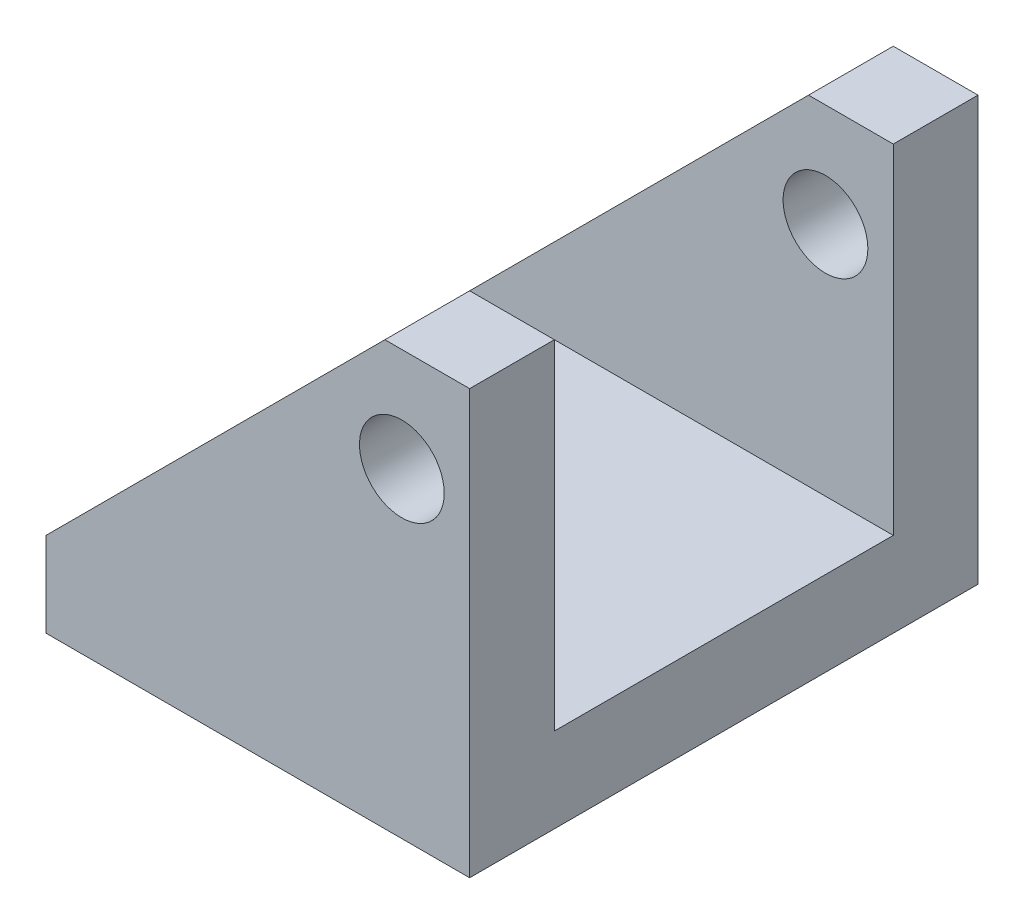
ISO-10303-21;
HEADER;
FILE_DESCRIPTION(('STEP AP214'),'2;1');
FILE_NAME('part.step','',(''),(''),'','','');
FILE_SCHEMA(('AUTOMOTIVE_DESIGN { 1 0 10303 214 1 1 1 1 }'));
ENDSEC;
DATA;
#1=APPLICATION_CONTEXT('core data for automotive mechanical design processes');
#2=APPLICATION_PROTOCOL_DEFINITION('international standard','automotive_design',2000,#1);
#3=PRODUCT_CONTEXT('',#1,'mechanical');
#4=PRODUCT('Part','Part','',(#3));
#5=PRODUCT_RELATED_PRODUCT_CATEGORY('part','',(#4));
#6=PRODUCT_DEFINITION_FORMATION('','',#4);
#7=PRODUCT_DEFINITION_CONTEXT('part definition',#1,'design');
#8=PRODUCT_DEFINITION('design','',#6,#7);
#9=PRODUCT_DEFINITION_SHAPE('','',#8);
#10=(LENGTH_UNIT() NAMED_UNIT(*) SI_UNIT(.MILLI.,.METRE.));
#11=(NAMED_UNIT(*) PLANE_ANGLE_UNIT() SI_UNIT($,.RADIAN.));
#12=(NAMED_UNIT(*) SI_UNIT($,.STERADIAN.) SOLID_ANGLE_UNIT());
#13=UNCERTAINTY_MEASURE_WITH_UNIT(LENGTH_MEASURE(1.E-05),#10,'distance_accuracy_value','');
#14=(GEOMETRIC_REPRESENTATION_CONTEXT(3) GLOBAL_UNCERTAINTY_ASSIGNED_CONTEXT((#13)) GLOBAL_UNIT_ASSIGNED_CONTEXT((#10,
#11,#12)) REPRESENTATION_CONTEXT('',''));
#15=CARTESIAN_POINT('',(0.,0.,0.));
#16=DIRECTION('',(0.,0.,1.));
#17=DIRECTION('',(1.,0.,0.));
#18=AXIS2_PLACEMENT_3D('',#15,#16,#17);
#19=CARTESIAN_POINT('',(-6.35,31.75,38.1));
#20=DIRECTION('',(0.,-1.,0.));
#21=DIRECTION('',(0.,0.,-1.));
#22=AXIS2_PLACEMENT_3D('',#19,#20,#21);
#23=PLANE('',#22);
#24=DIRECTION('',(0.,0.,-1.));
#25=VECTOR('',#24,1.);
#26=CARTESIAN_POINT('',(0.,31.75,38.1));
#27=LINE('',#26,#25);
#28=CARTESIAN_POINT('',(0.,31.75,38.1));
#29=VERTEX_POINT('',#28);
#30=CARTESIAN_POINT('',(0.,31.75,31.75));
#31=VERTEX_POINT('',#30);
#32=EDGE_CURVE('E117',#29,#31,#27,.T.);
#33=ORIENTED_EDGE('',*,*,#32,.T.);
#34=DIRECTION('',(1.,0.,0.));
#35=VECTOR('',#34,1.);
#36=CARTESIAN_POINT('',(-38.1,31.75,31.75));
#37=LINE('',#36,#35);
#38=CARTESIAN_POINT('',(-6.35000000000002,31.75,31.75));
#39=VERTEX_POINT('',#38);
#40=EDGE_CURVE('E141',#39,#31,#37,.T.);
#41=ORIENTED_EDGE('',*,*,#40,.F.);
#42=DIRECTION('',(0.,0.,-1.));
#43=VECTOR('',#42,1.);
#44=CARTESIAN_POINT('',(-6.35,31.75,38.1));
#45=LINE('',#44,#43);
#46=CARTESIAN_POINT('',(-6.35,31.75,38.1));
#47=VERTEX_POINT('',#46);
#48=EDGE_CURVE('E130',#47,#39,#45,.T.);
#49=ORIENTED_EDGE('',*,*,#48,.F.);
#50=DIRECTION('',(-1.,0.,0.));
#51=VECTOR('',#50,1.);
#52=CARTESIAN_POINT('',(-6.35,31.75,38.1));
#53=LINE('',#52,#51);
#54=EDGE_CURVE('E109',#29,#47,#53,.T.);
#55=ORIENTED_EDGE('',*,*,#54,.F.);
#56=EDGE_LOOP('',(#33,#41,#49,#55));
#57=FACE_BOUND('',#56,.T.);
#58=ADVANCED_FACE('F39',(#57),#23,.F.);
#59=CARTESIAN_POINT('',(-31.75,6.35,38.1));
#60=DIRECTION('',(0.707106781186547,-0.707106781186547,0.));
#61=DIRECTION('',(0.707106781186548,0.707106781186548,0.));
#62=AXIS2_PLACEMENT_3D('',#59,#60,#61);
#63=PLANE('',#62);
#64=ORIENTED_EDGE('',*,*,#48,.T.);
#65=DIRECTION('',(-0.707106781186547,-0.707106781186547,0.));
#66=VECTOR('',#65,1.);
#67=CARTESIAN_POINT('',(-31.75,6.35,31.75));
#68=LINE('',#67,#66);
#69=CARTESIAN_POINT('',(-31.75,6.35,31.75));
#70=VERTEX_POINT('',#69);
#71=EDGE_CURVE('E11',#39,#70,#68,.T.);
#72=ORIENTED_EDGE('',*,*,#71,.T.);
#73=DIRECTION('',(0.,0.,-1.));
#74=VECTOR('',#73,1.);
#75=CARTESIAN_POINT('',(-31.75,6.35,38.1));
#76=LINE('',#75,#74);
#77=CARTESIAN_POINT('',(-31.75,6.35,38.1));
#78=VERTEX_POINT('',#77);
#79=EDGE_CURVE('E156',#78,#70,#76,.T.);
#80=ORIENTED_EDGE('',*,*,#79,.F.);
#81=DIRECTION('',(-0.707106781186547,-0.707106781186547,0.));
#82=VECTOR('',#81,1.);
#83=CARTESIAN_POINT('',(-31.75,6.35,38.1));
#84=LINE('',#83,#82);
#85=EDGE_CURVE('E65',#47,#78,#84,.T.);
#86=ORIENTED_EDGE('',*,*,#85,.F.);
#87=EDGE_LOOP('',(#64,#72,#80,#86));
#88=FACE_BOUND('',#87,.T.);
#89=ADVANCED_FACE('F205',(#88),#63,.F.);
#90=CARTESIAN_POINT('',(-31.75,0.,38.1));
#91=DIRECTION('',(1.,0.,0.));
#92=DIRECTION('',(0.,0.,-1.));
#93=AXIS2_PLACEMENT_3D('',#90,#91,#92);
#94=PLANE('',#93);
#95=DIRECTION('',(0.,-1.,0.));
#96=VECTOR('',#95,1.);
#97=CARTESIAN_POINT('',(-31.75,0.,0.));
#98=LINE('',#97,#96);
#99=CARTESIAN_POINT('',(-31.75,6.35,0.));
#100=VERTEX_POINT('',#99);
#101=CARTESIAN_POINT('',(-31.75,0.,0.));
#102=VERTEX_POINT('',#101);
#103=EDGE_CURVE('E137',#100,#102,#98,.T.);
#104=ORIENTED_EDGE('',*,*,#103,.T.);
#105=DIRECTION('',(0.,0.,-1.));
#106=VECTOR('',#105,1.);
#107=CARTESIAN_POINT('',(-31.75,0.,38.1));
#108=LINE('',#107,#106);
#109=CARTESIAN_POINT('',(-31.75,0.,38.1));
#110=VERTEX_POINT('',#109);
#111=EDGE_CURVE('E166',#110,#102,#108,.T.);
#112=ORIENTED_EDGE('',*,*,#111,.F.);
#113=DIRECTION('',(0.,-1.,0.));
#114=VECTOR('',#113,1.);
#115=CARTESIAN_POINT('',(-31.75,0.,38.1));
#116=LINE('',#115,#114);
#117=EDGE_CURVE('E155',#78,#110,#116,.T.);
#118=ORIENTED_EDGE('',*,*,#117,.F.);
#119=ORIENTED_EDGE('',*,*,#79,.T.);
#120=CARTESIAN_POINT('',(-31.75,6.35,6.35000000000002));
#121=VERTEX_POINT('',#120);
#122=EDGE_CURVE('E161',#70,#121,#76,.T.);
#123=ORIENTED_EDGE('',*,*,#122,.T.);
#124=EDGE_CURVE('E90',#121,#100,#76,.T.);
#125=ORIENTED_EDGE('',*,*,#124,.T.);
#126=EDGE_LOOP('',(#104,#112,#118,#119,#123,#125));
#127=FACE_BOUND('',#126,.T.);
#128=ADVANCED_FACE('F41',(#127),#94,.F.);
#129=CARTESIAN_POINT('',(-31.75,0.,38.1));
#130=DIRECTION('',(0.,1.,0.));
#131=DIRECTION('',(0.,0.,1.));
#132=AXIS2_PLACEMENT_3D('',#129,#130,#131);
#133=PLANE('',#132);
#134=DIRECTION('',(1.,0.,0.));
#135=VECTOR('',#134,1.);
#136=CARTESIAN_POINT('',(-31.75,0.,0.));
#137=LINE('',#136,#135);
#138=CARTESIAN_POINT('',(0.,0.,0.));
#139=VERTEX_POINT('',#138);
#140=EDGE_CURVE('E140',#102,#139,#137,.T.);
#141=ORIENTED_EDGE('',*,*,#140,.T.);
#142=DIRECTION('',(0.,0.,-1.));
#143=VECTOR('',#142,1.);
#144=CARTESIAN_POINT('',(0.,0.,38.1));
#145=LINE('',#144,#143);
#146=CARTESIAN_POINT('',(0.,0.,38.1));
#147=VERTEX_POINT('',#146);
#148=EDGE_CURVE('E126',#147,#139,#145,.T.);
#149=ORIENTED_EDGE('',*,*,#148,.F.);
#150=DIRECTION('',(1.,0.,0.));
#151=VECTOR('',#150,1.);
#152=CARTESIAN_POINT('',(-31.75,0.,38.1));
#153=LINE('',#152,#151);
#154=EDGE_CURVE('E99',#110,#147,#153,.T.);
#155=ORIENTED_EDGE('',*,*,#154,.F.);
#156=ORIENTED_EDGE('',*,*,#111,.T.);
#157=EDGE_LOOP('',(#141,#149,#155,#156));
#158=FACE_BOUND('',#157,.T.);
#159=ADVANCED_FACE('F268',(#158),#133,.F.);
#160=CARTESIAN_POINT('',(0.,0.,38.1));
#161=DIRECTION('',(-1.,0.,0.));
#162=DIRECTION('',(0.,0.,1.));
#163=AXIS2_PLACEMENT_3D('',#160,#161,#162);
#164=PLANE('',#163);
#165=DIRECTION('',(0.,0.,-1.));
#166=VECTOR('',#165,1.);
#167=CARTESIAN_POINT('',(0.,6.35,31.75));
#168=LINE('',#167,#166);
#169=CARTESIAN_POINT('',(0.,6.35,31.75));
#170=VERTEX_POINT('',#169);
#171=CARTESIAN_POINT('',(0.,6.35,6.35));
#172=VERTEX_POINT('',#171);
#173=EDGE_CURVE('E220',#170,#172,#168,.T.);
#174=ORIENTED_EDGE('',*,*,#173,.F.);
#175=DIRECTION('',(0.,-1.,0.));
#176=VECTOR('',#175,1.);
#177=CARTESIAN_POINT('',(0.,31.75,31.75));
#178=LINE('',#177,#176);
#179=EDGE_CURVE('E122',#31,#170,#178,.T.);
#180=ORIENTED_EDGE('',*,*,#179,.F.);
#181=ORIENTED_EDGE('',*,*,#32,.F.);
#182=DIRECTION('',(0.,1.,0.));
#183=VECTOR('',#182,1.);
#184=CARTESIAN_POINT('',(0.,0.,38.1));
#185=LINE('',#184,#183);
#186=EDGE_CURVE('E105',#147,#29,#185,.T.);
#187=ORIENTED_EDGE('',*,*,#186,.F.);
#188=ORIENTED_EDGE('',*,*,#148,.T.);
#189=DIRECTION('',(0.,1.,0.));
#190=VECTOR('',#189,1.);
#191=CARTESIAN_POINT('',(0.,0.,0.));
#192=LINE('',#191,#190);
#193=CARTESIAN_POINT('',(0.,31.75,0.));
#194=VERTEX_POINT('',#193);
#195=EDGE_CURVE('E144',#139,#194,#192,.T.);
#196=ORIENTED_EDGE('',*,*,#195,.T.);
#197=CARTESIAN_POINT('',(0.,31.75,6.35));
#198=VERTEX_POINT('',#197);
#199=EDGE_CURVE('E127',#198,#194,#27,.T.);
#200=ORIENTED_EDGE('',*,*,#199,.F.);
#201=DIRECTION('',(0.,1.,0.));
#202=VECTOR('',#201,1.);
#203=CARTESIAN_POINT('',(0.,31.75,6.35));
#204=LINE('',#203,#202);
#205=EDGE_CURVE('E202',#172,#198,#204,.T.);
#206=ORIENTED_EDGE('',*,*,#205,.F.);
#207=EDGE_LOOP('',(#174,#180,#181,#187,#188,#196,#200,#206));
#208=FACE_BOUND('',#207,.T.);
#209=ADVANCED_FACE('F119',(#208),#164,.F.);
#210=CARTESIAN_POINT('',(-6.35,31.75,6.35));
#211=VERTEX_POINT('',#210);
#212=CARTESIAN_POINT('',(-6.35,31.75,0.));
#213=VERTEX_POINT('',#212);
#214=EDGE_CURVE('E160',#211,#213,#45,.T.);
#215=ORIENTED_EDGE('',*,*,#214,.F.);
#216=DIRECTION('',(1.,0.,0.));
#217=VECTOR('',#216,1.);
#218=CARTESIAN_POINT('',(-38.1,31.75,6.35));
#219=LINE('',#218,#217);
#220=EDGE_CURVE('E182',#211,#198,#219,.T.);
#221=ORIENTED_EDGE('',*,*,#220,.T.);
#222=ORIENTED_EDGE('',*,*,#199,.T.);
#223=DIRECTION('',(-1.,0.,0.));
#224=VECTOR('',#223,1.);
#225=CARTESIAN_POINT('',(-6.35,31.75,0.));
#226=LINE('',#225,#224);
#227=EDGE_CURVE('E148',#194,#213,#226,.T.);
#228=ORIENTED_EDGE('',*,*,#227,.T.);
#229=EDGE_LOOP('',(#215,#221,#222,#228));
#230=FACE_BOUND('',#229,.T.);
#231=ADVANCED_FACE('F180',(#230),#23,.F.);
#232=ORIENTED_EDGE('',*,*,#124,.F.);
#233=DIRECTION('',(0.707106781186547,0.707106781186547,0.));
#234=VECTOR('',#233,1.);
#235=CARTESIAN_POINT('',(-31.75,6.35,6.34999999999999));
#236=LINE('',#235,#234);
#237=EDGE_CURVE('E49',#121,#211,#236,.T.);
#238=ORIENTED_EDGE('',*,*,#237,.T.);
#239=ORIENTED_EDGE('',*,*,#214,.T.);
#240=DIRECTION('',(-0.707106781186547,-0.707106781186547,0.));
#241=VECTOR('',#240,1.);
#242=CARTESIAN_POINT('',(-31.75,6.35,0.));
#243=LINE('',#242,#241);
#244=EDGE_CURVE('E152',#213,#100,#243,.T.);
#245=ORIENTED_EDGE('',*,*,#244,.T.);
#246=EDGE_LOOP('',(#232,#238,#239,#245));
#247=FACE_BOUND('',#246,.T.);
#248=ADVANCED_FACE('F174',(#247),#63,.F.);
#249=CARTESIAN_POINT('',(0.,0.,38.1));
#250=DIRECTION('',(0.,0.,-1.));
#251=DIRECTION('',(-1.,0.,0.));
#252=AXIS2_PLACEMENT_3D('',#249,#250,#251);
#253=PLANE('',#252);
#254=CARTESIAN_POINT('',(-5.08,24.,38.1));
#255=DIRECTION('',(0.,0.,1.));
#256=DIRECTION('',(1.,0.,0.));
#257=AXIS2_PLACEMENT_3D('',#254,#255,#256);
#258=CIRCLE('',#257,3.175);
#259=CARTESIAN_POINT('',(-1.905,24.,38.1));
#260=VERTEX_POINT('',#259);
#261=EDGE_CURVE('E229',#260,#260,#258,.T.);
#262=ORIENTED_EDGE('',*,*,#261,.F.);
#263=EDGE_LOOP('',(#262));
#264=FACE_BOUND('',#263,.T.);
#265=ORIENTED_EDGE('',*,*,#117,.T.);
#266=ORIENTED_EDGE('',*,*,#154,.T.);
#267=ORIENTED_EDGE('',*,*,#186,.T.);
#268=ORIENTED_EDGE('',*,*,#54,.T.);
#269=ORIENTED_EDGE('',*,*,#85,.T.);
#270=EDGE_LOOP('',(#265,#266,#267,#268,#269));
#271=FACE_BOUND('',#270,.T.);
#272=ADVANCED_FACE('F107',(#264,#271),#253,.F.);
#273=CARTESIAN_POINT('',(0.,0.,0.));
#274=DIRECTION('',(0.,0.,-1.));
#275=DIRECTION('',(-1.,0.,0.));
#276=AXIS2_PLACEMENT_3D('',#273,#274,#275);
#277=PLANE('',#276);
#278=CARTESIAN_POINT('',(-5.08,24.,0.));
#279=DIRECTION('',(0.,0.,1.));
#280=DIRECTION('',(1.,0.,0.));
#281=AXIS2_PLACEMENT_3D('',#278,#279,#280);
#282=CIRCLE('',#281,3.175);
#283=CARTESIAN_POINT('',(-1.905,24.,0.));
#284=VERTEX_POINT('',#283);
#285=EDGE_CURVE('E233',#284,#284,#282,.T.);
#286=ORIENTED_EDGE('',*,*,#285,.T.);
#287=EDGE_LOOP('',(#286));
#288=FACE_BOUND('',#287,.T.);
#289=ORIENTED_EDGE('',*,*,#103,.F.);
#290=ORIENTED_EDGE('',*,*,#244,.F.);
#291=ORIENTED_EDGE('',*,*,#227,.F.);
#292=ORIENTED_EDGE('',*,*,#195,.F.);
#293=ORIENTED_EDGE('',*,*,#140,.F.);
#294=EDGE_LOOP('',(#289,#290,#291,#292,#293));
#295=FACE_BOUND('',#294,.T.);
#296=ADVANCED_FACE('F278',(#288,#295),#277,.T.);
#297=CARTESIAN_POINT('',(-38.1,31.75,31.75));
#298=DIRECTION('',(0.,0.,1.));
#299=DIRECTION('',(1.,0.,0.));
#300=AXIS2_PLACEMENT_3D('',#297,#298,#299);
#301=PLANE('',#300);
#302=CARTESIAN_POINT('',(-5.08,24.,31.75));
#303=DIRECTION('',(0.,0.,1.));
#304=DIRECTION('',(1.,0.,0.));
#305=AXIS2_PLACEMENT_3D('',#302,#303,#304);
#306=CIRCLE('',#305,3.175);
#307=CARTESIAN_POINT('',(-1.905,24.,31.75));
#308=VERTEX_POINT('',#307);
#309=EDGE_CURVE('E225',#308,#308,#306,.T.);
#310=ORIENTED_EDGE('',*,*,#309,.T.);
#311=EDGE_LOOP('',(#310));
#312=FACE_BOUND('',#311,.T.);
#313=ORIENTED_EDGE('',*,*,#40,.T.);
#314=ORIENTED_EDGE('',*,*,#179,.T.);
#315=DIRECTION('',(1.,0.,0.));
#316=VECTOR('',#315,1.);
#317=CARTESIAN_POINT('',(-38.1,6.35,31.75));
#318=LINE('',#317,#316);
#319=EDGE_CURVE('E195',#70,#170,#318,.T.);
#320=ORIENTED_EDGE('',*,*,#319,.F.);
#321=ORIENTED_EDGE('',*,*,#71,.F.);
#322=EDGE_LOOP('',(#313,#314,#320,#321));
#323=FACE_BOUND('',#322,.T.);
#324=ADVANCED_FACE('F200',(#312,#323),#301,.F.);
#325=CARTESIAN_POINT('',(-38.1,31.75,6.35));
#326=DIRECTION('',(0.,0.,-1.));
#327=DIRECTION('',(0.,1.,0.));
#328=AXIS2_PLACEMENT_3D('',#325,#326,#327);
#329=PLANE('',#328);
#330=CARTESIAN_POINT('',(-5.08,24.,6.35));
#331=DIRECTION('',(0.,0.,-1.));
#332=DIRECTION('',(0.,1.,0.));
#333=AXIS2_PLACEMENT_3D('',#330,#331,#332);
#334=CIRCLE('',#333,3.175);
#335=CARTESIAN_POINT('',(-1.905,24.,6.35));
#336=VERTEX_POINT('',#335);
#337=EDGE_CURVE('E43',#336,#336,#334,.T.);
#338=ORIENTED_EDGE('',*,*,#337,.T.);
#339=EDGE_LOOP('',(#338));
#340=FACE_BOUND('',#339,.T.);
#341=DIRECTION('',(1.,0.,0.));
#342=VECTOR('',#341,1.);
#343=CARTESIAN_POINT('',(-38.1,6.35,6.35));
#344=LINE('',#343,#342);
#345=EDGE_CURVE('E56',#121,#172,#344,.T.);
#346=ORIENTED_EDGE('',*,*,#345,.T.);
#347=ORIENTED_EDGE('',*,*,#205,.T.);
#348=ORIENTED_EDGE('',*,*,#220,.F.);
#349=ORIENTED_EDGE('',*,*,#237,.F.);
#350=EDGE_LOOP('',(#346,#347,#348,#349));
#351=FACE_BOUND('',#350,.T.);
#352=ADVANCED_FACE('F242',(#340,#351),#329,.F.);
#353=CARTESIAN_POINT('',(-38.1,6.35,31.75));
#354=DIRECTION('',(0.,-1.,0.));
#355=DIRECTION('',(0.,0.,-1.));
#356=AXIS2_PLACEMENT_3D('',#353,#354,#355);
#357=PLANE('',#356);
#358=ORIENTED_EDGE('',*,*,#319,.T.);
#359=ORIENTED_EDGE('',*,*,#173,.T.);
#360=ORIENTED_EDGE('',*,*,#345,.F.);
#361=ORIENTED_EDGE('',*,*,#122,.F.);
#362=EDGE_LOOP('',(#358,#359,#360,#361));
#363=FACE_BOUND('',#362,.T.);
#364=ADVANCED_FACE('F193',(#363),#357,.F.);
#365=CARTESIAN_POINT('',(-5.08,24.,0.));
#366=DIRECTION('',(0.,0.,1.));
#367=DIRECTION('',(1.,0.,0.));
#368=AXIS2_PLACEMENT_3D('',#365,#366,#367);
#369=CYLINDRICAL_SURFACE('',#368,3.175);
#370=CARTESIAN_POINT('',(-1.905,24.,0.));
#371=CARTESIAN_POINT('',(-1.905,24.,0.0661458333333333));
#372=CARTESIAN_POINT('',(-1.905,24.,0.132291666666667));
#373=CARTESIAN_POINT('',(-1.905,24.,0.264583333333333));
#374=CARTESIAN_POINT('',(-1.905,24.,0.330729166666667));
#375=CARTESIAN_POINT('',(-1.905,24.,0.463020833333333));
#376=CARTESIAN_POINT('',(-1.905,24.,0.529166666666667));
#377=CARTESIAN_POINT('',(-1.905,24.,0.661458333333333));
#378=CARTESIAN_POINT('',(-1.905,24.,0.727604166666667));
#379=CARTESIAN_POINT('',(-1.905,24.,0.859895833333333));
#380=CARTESIAN_POINT('',(-1.905,24.,0.926041666666667));
#381=CARTESIAN_POINT('',(-1.905,24.,1.05833333333333));
#382=CARTESIAN_POINT('',(-1.905,24.,1.12447916666667));
#383=CARTESIAN_POINT('',(-1.905,24.,1.25677083333333));
#384=CARTESIAN_POINT('',(-1.905,24.,1.32291666666667));
#385=CARTESIAN_POINT('',(-1.905,24.,1.45520833333333));
#386=CARTESIAN_POINT('',(-1.905,24.,1.52135416666667));
#387=CARTESIAN_POINT('',(-1.905,24.,1.65364583333333));
#388=CARTESIAN_POINT('',(-1.905,24.,1.71979166666667));
#389=CARTESIAN_POINT('',(-1.905,24.,1.85208333333333));
#390=CARTESIAN_POINT('',(-1.905,24.,1.91822916666667));
#391=CARTESIAN_POINT('',(-1.905,24.,2.05052083333333));
#392=CARTESIAN_POINT('',(-1.905,24.,2.11666666666667));
#393=CARTESIAN_POINT('',(-1.905,24.,2.24895833333333));
#394=CARTESIAN_POINT('',(-1.905,24.,2.31510416666667));
#395=CARTESIAN_POINT('',(-1.905,24.,2.44739583333333));
#396=CARTESIAN_POINT('',(-1.905,24.,2.51354166666667));
#397=CARTESIAN_POINT('',(-1.905,24.,2.64583333333333));
#398=CARTESIAN_POINT('',(-1.905,24.,2.71197916666667));
#399=CARTESIAN_POINT('',(-1.905,24.,2.84427083333333));
#400=CARTESIAN_POINT('',(-1.905,24.,2.91041666666667));
#401=CARTESIAN_POINT('',(-1.905,24.,3.04270833333333));
#402=CARTESIAN_POINT('',(-1.905,24.,3.10885416666667));
#403=CARTESIAN_POINT('',(-1.905,24.,3.24114583333333));
#404=CARTESIAN_POINT('',(-1.905,24.,3.30729166666667));
#405=CARTESIAN_POINT('',(-1.905,24.,3.43958333333333));
#406=CARTESIAN_POINT('',(-1.905,24.,3.50572916666667));
#407=CARTESIAN_POINT('',(-1.905,24.,3.63802083333333));
#408=CARTESIAN_POINT('',(-1.905,24.,3.70416666666667));
#409=CARTESIAN_POINT('',(-1.905,24.,3.83645833333333));
#410=CARTESIAN_POINT('',(-1.905,24.,3.90260416666667));
#411=CARTESIAN_POINT('',(-1.905,24.,4.03489583333333));
#412=CARTESIAN_POINT('',(-1.905,24.,4.10104166666667));
#413=CARTESIAN_POINT('',(-1.905,24.,4.23333333333333));
#414=CARTESIAN_POINT('',(-1.905,24.,4.29947916666667));
#415=CARTESIAN_POINT('',(-1.905,24.,4.43177083333333));
#416=CARTESIAN_POINT('',(-1.905,24.,4.49791666666667));
#417=CARTESIAN_POINT('',(-1.905,24.,4.63020833333333));
#418=CARTESIAN_POINT('',(-1.905,24.,4.69635416666667));
#419=CARTESIAN_POINT('',(-1.905,24.,4.82864583333333));
#420=CARTESIAN_POINT('',(-1.905,24.,4.89479166666667));
#421=CARTESIAN_POINT('',(-1.905,24.,5.02708333333333));
#422=CARTESIAN_POINT('',(-1.905,24.,5.09322916666667));
#423=CARTESIAN_POINT('',(-1.905,24.,5.22552083333333));
#424=CARTESIAN_POINT('',(-1.905,24.,5.29166666666667));
#425=CARTESIAN_POINT('',(-1.905,24.,5.42395833333333));
#426=CARTESIAN_POINT('',(-1.905,24.,5.49010416666667));
#427=CARTESIAN_POINT('',(-1.905,24.,5.62239583333333));
#428=CARTESIAN_POINT('',(-1.905,24.,5.68854166666667));
#429=CARTESIAN_POINT('',(-1.905,24.,5.82083333333333));
#430=CARTESIAN_POINT('',(-1.905,24.,5.88697916666667));
#431=CARTESIAN_POINT('',(-1.905,24.,6.01927083333333));
#432=CARTESIAN_POINT('',(-1.905,24.,6.08541666666667));
#433=CARTESIAN_POINT('',(-1.905,24.,6.21770833333333));
#434=CARTESIAN_POINT('',(-1.905,24.,6.28385416666667));
#435=CARTESIAN_POINT('',(-1.905,24.,6.35));
#436=B_SPLINE_CURVE_WITH_KNOTS('',3,(#370,#371,#372,#373,#374,#375,#376,#377,#378,#379,#380,
#381,#382,#383,#384,#385,#386,#387,#388,#389,#390,#391,#392,#393,#394,#395,#396,#397,#398,#399,
#400,#401,#402,#403,#404,#405,#406,#407,#408,#409,#410,#411,#412,#413,#414,#415,#416,#417,#418,
#419,#420,#421,#422,#423,#424,#425,#426,#427,#428,#429,#430,#431,#432,#433,#434,#435),
.UNSPECIFIED.,.F.,.F.,(4,2,2,2,2,2,2,2,2,2,2,2,2,2,2,2,2,2,2,2,2,2,2,2,2,2,2,2,2,2,2,2,4),(0.,
0.1984375,0.396875,0.5953125,0.79375,0.9921875,1.190625,1.3890625,1.5875,1.7859375,1.984375,
2.1828125,2.38125,2.5796875,2.778125,2.9765625,3.175,3.3734375,3.571875,3.7703125,3.96875,
4.1671875,4.365625,4.5640625,4.7625,4.9609375,5.159375,5.3578125,5.55625,5.7546875,5.953125,
6.1515625,6.35),.UNSPECIFIED.);
#437=EDGE_CURVE('BSEAM244',#284,#336,#436,.T.);
#438=ORIENTED_EDGE('',*,*,#285,.F.);
#439=ORIENTED_EDGE('',*,*,#337,.F.);
#440=ORIENTED_EDGE('',*,*,#437,.T.);
#441=ORIENTED_EDGE('',*,*,#437,.F.);
#442=EDGE_LOOP('',(#438,#440,#439,#441));
#443=FACE_BOUND('',#442,.T.);
#444=ADVANCED_FACE('F244',(#443),#369,.F.);
#445=CARTESIAN_POINT('',(-1.905,24.,38.1));
#446=CARTESIAN_POINT('',(-1.905,24.,38.0338541666667));
#447=CARTESIAN_POINT('',(-1.905,24.,37.9677083333333));
#448=CARTESIAN_POINT('',(-1.905,24.,37.8354166666667));
#449=CARTESIAN_POINT('',(-1.905,24.,37.7692708333333));
#450=CARTESIAN_POINT('',(-1.905,24.,37.6369791666667));
#451=CARTESIAN_POINT('',(-1.905,24.,37.5708333333333));
#452=CARTESIAN_POINT('',(-1.905,24.,37.4385416666667));
#453=CARTESIAN_POINT('',(-1.905,24.,37.3723958333333));
#454=CARTESIAN_POINT('',(-1.905,24.,37.2401041666667));
#455=CARTESIAN_POINT('',(-1.905,24.,37.1739583333333));
#456=CARTESIAN_POINT('',(-1.905,24.,37.0416666666667));
#457=CARTESIAN_POINT('',(-1.905,24.,36.9755208333333));
#458=CARTESIAN_POINT('',(-1.905,24.,36.8432291666667));
#459=CARTESIAN_POINT('',(-1.905,24.,36.7770833333333));
#460=CARTESIAN_POINT('',(-1.905,24.,36.6447916666667));
#461=CARTESIAN_POINT('',(-1.905,24.,36.5786458333333));
#462=CARTESIAN_POINT('',(-1.905,24.,36.4463541666667));
#463=CARTESIAN_POINT('',(-1.905,24.,36.3802083333333));
#464=CARTESIAN_POINT('',(-1.905,24.,36.2479166666667));
#465=CARTESIAN_POINT('',(-1.905,24.,36.1817708333333));
#466=CARTESIAN_POINT('',(-1.905,24.,36.0494791666667));
#467=CARTESIAN_POINT('',(-1.905,24.,35.9833333333333));
#468=CARTESIAN_POINT('',(-1.905,24.,35.8510416666667));
#469=CARTESIAN_POINT('',(-1.905,24.,35.7848958333333));
#470=CARTESIAN_POINT('',(-1.905,24.,35.6526041666667));
#471=CARTESIAN_POINT('',(-1.905,24.,35.5864583333333));
#472=CARTESIAN_POINT('',(-1.905,24.,35.4541666666667));
#473=CARTESIAN_POINT('',(-1.905,24.,35.3880208333333));
#474=CARTESIAN_POINT('',(-1.905,24.,35.2557291666667));
#475=CARTESIAN_POINT('',(-1.905,24.,35.1895833333333));
#476=CARTESIAN_POINT('',(-1.905,24.,35.0572916666667));
#477=CARTESIAN_POINT('',(-1.905,24.,34.9911458333333));
#478=CARTESIAN_POINT('',(-1.905,24.,34.8588541666667));
#479=CARTESIAN_POINT('',(-1.905,24.,34.7927083333333));
#480=CARTESIAN_POINT('',(-1.905,24.,34.6604166666667));
#481=CARTESIAN_POINT('',(-1.905,24.,34.5942708333333));
#482=CARTESIAN_POINT('',(-1.905,24.,34.4619791666667));
#483=CARTESIAN_POINT('',(-1.905,24.,34.3958333333333));
#484=CARTESIAN_POINT('',(-1.905,24.,34.2635416666667));
#485=CARTESIAN_POINT('',(-1.905,24.,34.1973958333333));
#486=CARTESIAN_POINT('',(-1.905,24.,34.0651041666667));
#487=CARTESIAN_POINT('',(-1.905,24.,33.9989583333333));
#488=CARTESIAN_POINT('',(-1.905,24.,33.8666666666667));
#489=CARTESIAN_POINT('',(-1.905,24.,33.8005208333333));
#490=CARTESIAN_POINT('',(-1.905,24.,33.6682291666667));
#491=CARTESIAN_POINT('',(-1.905,24.,33.6020833333333));
#492=CARTESIAN_POINT('',(-1.905,24.,33.4697916666667));
#493=CARTESIAN_POINT('',(-1.905,24.,33.4036458333333));
#494=CARTESIAN_POINT('',(-1.905,24.,33.2713541666667));
#495=CARTESIAN_POINT('',(-1.905,24.,33.2052083333333));
#496=CARTESIAN_POINT('',(-1.905,24.,33.0729166666667));
#497=CARTESIAN_POINT('',(-1.905,24.,33.0067708333333));
#498=CARTESIAN_POINT('',(-1.905,24.,32.8744791666667));
#499=CARTESIAN_POINT('',(-1.905,24.,32.8083333333333));
#500=CARTESIAN_POINT('',(-1.905,24.,32.6760416666667));
#501=CARTESIAN_POINT('',(-1.905,24.,32.6098958333333));
#502=CARTESIAN_POINT('',(-1.905,24.,32.4776041666667));
#503=CARTESIAN_POINT('',(-1.905,24.,32.4114583333333));
#504=CARTESIAN_POINT('',(-1.905,24.,32.2791666666667));
#505=CARTESIAN_POINT('',(-1.905,24.,32.2130208333333));
#506=CARTESIAN_POINT('',(-1.905,24.,32.0807291666667));
#507=CARTESIAN_POINT('',(-1.905,24.,32.0145833333333));
#508=CARTESIAN_POINT('',(-1.905,24.,31.8822916666667));
#509=CARTESIAN_POINT('',(-1.905,24.,31.8161458333333));
#510=CARTESIAN_POINT('',(-1.905,24.,31.75));
#511=B_SPLINE_CURVE_WITH_KNOTS('',3,(#445,#446,#447,#448,#449,#450,#451,#452,#453,#454,#455,
#456,#457,#458,#459,#460,#461,#462,#463,#464,#465,#466,#467,#468,#469,#470,#471,#472,#473,#474,
#475,#476,#477,#478,#479,#480,#481,#482,#483,#484,#485,#486,#487,#488,#489,#490,#491,#492,#493,
#494,#495,#496,#497,#498,#499,#500,#501,#502,#503,#504,#505,#506,#507,#508,#509,#510),
.UNSPECIFIED.,.F.,.F.,(4,2,2,2,2,2,2,2,2,2,2,2,2,2,2,2,2,2,2,2,2,2,2,2,2,2,2,2,2,2,2,2,4),(0.,
0.198437500000002,0.396874999999998,0.5953125,0.793750000000003,0.992187499999998,1.190625,
1.3890625,1.58750000000001,1.7859375,1.984375,2.18281250000001,2.38125,2.5796875,
2.77812500000001,2.9765625,3.175,3.37343750000001,3.571875,3.7703125,3.96875000000001,4.1671875,
4.365625,4.56406250000001,4.7625,4.96093750000001,5.15937500000001,5.3578125,5.55625000000001,
5.75468750000001,5.95312500000001,6.15156250000001,6.35000000000001),.UNSPECIFIED.);
#512=EDGE_CURVE('BSEAM246',#260,#308,#511,.T.);
#513=ORIENTED_EDGE('',*,*,#261,.T.);
#514=ORIENTED_EDGE('',*,*,#309,.F.);
#515=ORIENTED_EDGE('',*,*,#512,.T.);
#516=ORIENTED_EDGE('',*,*,#512,.F.);
#517=EDGE_LOOP('',(#513,#515,#514,#516));
#518=FACE_BOUND('',#517,.T.);
#519=ADVANCED_FACE('F246',(#518),#369,.F.);
#520=CLOSED_SHELL('',(#58,#89,#128,#159,#209,#231,#248,#272,#296,#324,#352,#364,#444,#519));
#521=MANIFOLD_SOLID_BREP('B2',#520);
#522=ADVANCED_BREP_SHAPE_REPRESENTATION('',(#18,#521),#14);
#523=SHAPE_DEFINITION_REPRESENTATION(#9,#522);
ENDSEC;
END-ISO-10303-21;
